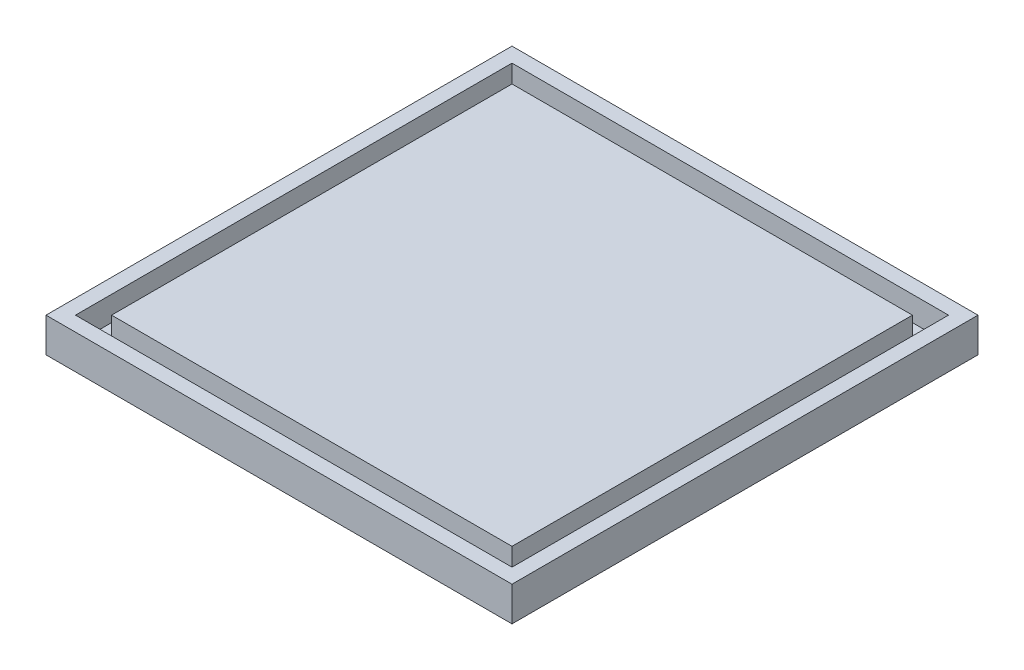
ISO-10303-21;
HEADER;
FILE_DESCRIPTION(('STEP AP214'),'2;1');
FILE_NAME('part.step','',(''),(''),'','','');
FILE_SCHEMA(('AUTOMOTIVE_DESIGN { 1 0 10303 214 1 1 1 1 }'));
ENDSEC;
DATA;
#1=APPLICATION_CONTEXT('core data for automotive mechanical design processes');
#2=APPLICATION_PROTOCOL_DEFINITION('international standard','automotive_design',2000,#1);
#3=PRODUCT_CONTEXT('',#1,'mechanical');
#4=PRODUCT('Part','Part','',(#3));
#5=PRODUCT_RELATED_PRODUCT_CATEGORY('part','',(#4));
#6=PRODUCT_DEFINITION_FORMATION('','',#4);
#7=PRODUCT_DEFINITION_CONTEXT('part definition',#1,'design');
#8=PRODUCT_DEFINITION('design','',#6,#7);
#9=PRODUCT_DEFINITION_SHAPE('','',#8);
#10=(LENGTH_UNIT() NAMED_UNIT(*) SI_UNIT(.MILLI.,.METRE.));
#11=(NAMED_UNIT(*) PLANE_ANGLE_UNIT() SI_UNIT($,.RADIAN.));
#12=(NAMED_UNIT(*) SI_UNIT($,.STERADIAN.) SOLID_ANGLE_UNIT());
#13=UNCERTAINTY_MEASURE_WITH_UNIT(LENGTH_MEASURE(1.E-05),#10,'distance_accuracy_value','');
#14=(GEOMETRIC_REPRESENTATION_CONTEXT(3) GLOBAL_UNCERTAINTY_ASSIGNED_CONTEXT((#13)) GLOBAL_UNIT_ASSIGNED_CONTEXT((#10,
#11,#12)) REPRESENTATION_CONTEXT('',''));
#15=CARTESIAN_POINT('',(0.,0.,0.));
#16=DIRECTION('',(0.,0.,1.));
#17=DIRECTION('',(1.,0.,0.));
#18=AXIS2_PLACEMENT_3D('',#15,#16,#17);
#19=CARTESIAN_POINT('',(0.,0.,0.));
#20=DIRECTION('',(0.,-1.,0.));
#21=DIRECTION('',(0.,0.,-1.));
#22=AXIS2_PLACEMENT_3D('',#19,#20,#21);
#23=PLANE('',#22);
#24=DIRECTION('',(1.,0.,0.));
#25=VECTOR('',#24,1.);
#26=CARTESIAN_POINT('',(0.,0.,-85.175));
#27=LINE('',#26,#25);
#28=CARTESIAN_POINT('',(-3.675,0.,-85.175));
#29=VERTEX_POINT('',#28);
#30=CARTESIAN_POINT('',(85.175,0.,-85.175));
#31=VERTEX_POINT('',#30);
#32=EDGE_CURVE('E115',#29,#31,#27,.T.);
#33=ORIENTED_EDGE('',*,*,#32,.F.);
#34=DIRECTION('',(0.,0.,1.));
#35=VECTOR('',#34,1.);
#36=CARTESIAN_POINT('',(-3.67499999999999,0.,0.));
#37=LINE('',#36,#35);
#38=CARTESIAN_POINT('',(-3.67499999999999,0.,3.675));
#39=VERTEX_POINT('',#38);
#40=EDGE_CURVE('E169',#29,#39,#37,.T.);
#41=ORIENTED_EDGE('',*,*,#40,.T.);
#42=DIRECTION('',(1.,0.,0.));
#43=VECTOR('',#42,1.);
#44=CARTESIAN_POINT('',(0.,0.,3.675));
#45=LINE('',#44,#43);
#46=CARTESIAN_POINT('',(85.175,0.,3.675));
#47=VERTEX_POINT('',#46);
#48=EDGE_CURVE('E106',#39,#47,#45,.T.);
#49=ORIENTED_EDGE('',*,*,#48,.T.);
#50=DIRECTION('',(0.,0.,1.));
#51=VECTOR('',#50,1.);
#52=CARTESIAN_POINT('',(85.175,0.,0.));
#53=LINE('',#52,#51);
#54=EDGE_CURVE('E147',#31,#47,#53,.T.);
#55=ORIENTED_EDGE('',*,*,#54,.F.);
#56=EDGE_LOOP('',(#33,#41,#49,#55));
#57=FACE_BOUND('',#56,.T.);
#58=DIRECTION('',(1.,0.,0.));
#59=VECTOR('',#58,1.);
#60=CARTESIAN_POINT('',(0.,0.,0.));
#61=LINE('',#60,#59);
#62=CARTESIAN_POINT('',(0.,0.,0.));
#63=VERTEX_POINT('',#62);
#64=CARTESIAN_POINT('',(81.5,0.,0.));
#65=VERTEX_POINT('',#64);
#66=EDGE_CURVE('E425',#63,#65,#61,.T.);
#67=ORIENTED_EDGE('',*,*,#66,.F.);
#68=DIRECTION('',(0.,0.,-1.));
#69=VECTOR('',#68,1.);
#70=CARTESIAN_POINT('',(0.,0.,0.));
#71=LINE('',#70,#69);
#72=CARTESIAN_POINT('',(0.,0.,-81.5));
#73=VERTEX_POINT('',#72);
#74=EDGE_CURVE('E420',#63,#73,#71,.T.);
#75=ORIENTED_EDGE('',*,*,#74,.T.);
#76=DIRECTION('',(1.,0.,0.));
#77=VECTOR('',#76,1.);
#78=CARTESIAN_POINT('',(0.,0.,-81.5));
#79=LINE('',#78,#77);
#80=CARTESIAN_POINT('',(81.5,0.,-81.5));
#81=VERTEX_POINT('',#80);
#82=EDGE_CURVE('E83',#73,#81,#79,.T.);
#83=ORIENTED_EDGE('',*,*,#82,.T.);
#84=DIRECTION('',(0.,0.,-1.));
#85=VECTOR('',#84,1.);
#86=CARTESIAN_POINT('',(81.5,0.,0.));
#87=LINE('',#86,#85);
#88=EDGE_CURVE('E429',#65,#81,#87,.T.);
#89=ORIENTED_EDGE('',*,*,#88,.F.);
#90=EDGE_LOOP('',(#67,#75,#83,#89));
#91=FACE_BOUND('',#90,.T.);
#92=ADVANCED_FACE('F65',(#57,#91),#23,.F.);
#93=CARTESIAN_POINT('',(0.,5.,-85.175));
#94=DIRECTION('',(0.,0.,-1.));
#95=DIRECTION('',(-1.,0.,0.));
#96=AXIS2_PLACEMENT_3D('',#93,#94,#95);
#97=PLANE('',#96);
#98=ORIENTED_EDGE('',*,*,#32,.T.);
#99=DIRECTION('',(0.,-1.,0.));
#100=VECTOR('',#99,1.);
#101=CARTESIAN_POINT('',(85.175,5.,-85.175));
#102=LINE('',#101,#100);
#103=CARTESIAN_POINT('',(85.175,5.,-85.175));
#104=VERTEX_POINT('',#103);
#105=EDGE_CURVE('E12',#104,#31,#102,.T.);
#106=ORIENTED_EDGE('',*,*,#105,.F.);
#107=DIRECTION('',(1.,0.,0.));
#108=VECTOR('',#107,1.);
#109=CARTESIAN_POINT('',(0.,5.,-85.175));
#110=LINE('',#109,#108);
#111=CARTESIAN_POINT('',(-3.675,5.,-85.175));
#112=VERTEX_POINT('',#111);
#113=EDGE_CURVE('E140',#112,#104,#110,.T.);
#114=ORIENTED_EDGE('',*,*,#113,.F.);
#115=DIRECTION('',(0.,-1.,0.));
#116=VECTOR('',#115,1.);
#117=CARTESIAN_POINT('',(-3.675,5.,-85.175));
#118=LINE('',#117,#116);
#119=EDGE_CURVE('E92',#112,#29,#118,.T.);
#120=ORIENTED_EDGE('',*,*,#119,.T.);
#121=EDGE_LOOP('',(#98,#106,#114,#120));
#122=FACE_BOUND('',#121,.T.);
#123=ADVANCED_FACE('F260',(#122),#97,.F.);
#124=CARTESIAN_POINT('',(85.175,5.,0.));
#125=DIRECTION('',(1.,0.,0.));
#126=DIRECTION('',(0.,0.,-1.));
#127=AXIS2_PLACEMENT_3D('',#124,#125,#126);
#128=PLANE('',#127);
#129=ORIENTED_EDGE('',*,*,#54,.T.);
#130=DIRECTION('',(0.,-1.,0.));
#131=VECTOR('',#130,1.);
#132=CARTESIAN_POINT('',(85.175,5.,3.675));
#133=LINE('',#132,#131);
#134=CARTESIAN_POINT('',(85.175,5.,3.675));
#135=VERTEX_POINT('',#134);
#136=EDGE_CURVE('E75',#135,#47,#133,.T.);
#137=ORIENTED_EDGE('',*,*,#136,.F.);
#138=DIRECTION('',(0.,0.,1.));
#139=VECTOR('',#138,1.);
#140=CARTESIAN_POINT('',(85.175,5.,0.));
#141=LINE('',#140,#139);
#142=EDGE_CURVE('E134',#104,#135,#141,.T.);
#143=ORIENTED_EDGE('',*,*,#142,.F.);
#144=ORIENTED_EDGE('',*,*,#105,.T.);
#145=EDGE_LOOP('',(#129,#137,#143,#144));
#146=FACE_BOUND('',#145,.T.);
#147=ADVANCED_FACE('F146',(#146),#128,.F.);
#148=CARTESIAN_POINT('',(0.,5.,3.675));
#149=DIRECTION('',(0.,0.,-1.));
#150=DIRECTION('',(-1.,0.,0.));
#151=AXIS2_PLACEMENT_3D('',#148,#149,#150);
#152=PLANE('',#151);
#153=ORIENTED_EDGE('',*,*,#48,.F.);
#154=DIRECTION('',(0.,-1.,0.));
#155=VECTOR('',#154,1.);
#156=CARTESIAN_POINT('',(-3.67499999999999,5.,3.675));
#157=LINE('',#156,#155);
#158=CARTESIAN_POINT('',(-3.67499999999999,5.,3.675));
#159=VERTEX_POINT('',#158);
#160=EDGE_CURVE('E150',#159,#39,#157,.T.);
#161=ORIENTED_EDGE('',*,*,#160,.F.);
#162=DIRECTION('',(1.,0.,0.));
#163=VECTOR('',#162,1.);
#164=CARTESIAN_POINT('',(0.,5.,3.675));
#165=LINE('',#164,#163);
#166=EDGE_CURVE('E139',#159,#135,#165,.T.);
#167=ORIENTED_EDGE('',*,*,#166,.T.);
#168=ORIENTED_EDGE('',*,*,#136,.T.);
#169=EDGE_LOOP('',(#153,#161,#167,#168));
#170=FACE_BOUND('',#169,.T.);
#171=ADVANCED_FACE('F152',(#170),#152,.T.);
#172=CARTESIAN_POINT('',(-6.675,5.,0.));
#173=DIRECTION('',(-1.,0.,0.));
#174=DIRECTION('',(0.,0.,1.));
#175=AXIS2_PLACEMENT_3D('',#172,#173,#174);
#176=PLANE('',#175);
#177=DIRECTION('',(0.,-1.,0.));
#178=VECTOR('',#177,1.);
#179=CARTESIAN_POINT('',(-6.675,5.,-88.175));
#180=LINE('',#179,#178);
#181=CARTESIAN_POINT('',(-6.675,5.,-88.175));
#182=VERTEX_POINT('',#181);
#183=CARTESIAN_POINT('',(-6.675,-2.,-88.175));
#184=VERTEX_POINT('',#183);
#185=EDGE_CURVE('E158',#182,#184,#180,.T.);
#186=ORIENTED_EDGE('',*,*,#185,.T.);
#187=DIRECTION('',(0.,0.,-1.));
#188=VECTOR('',#187,1.);
#189=CARTESIAN_POINT('',(-6.675,-2.,6.67500000000001));
#190=LINE('',#189,#188);
#191=CARTESIAN_POINT('',(-6.675,-2.,6.67500000000001));
#192=VERTEX_POINT('',#191);
#193=EDGE_CURVE('E211',#192,#184,#190,.T.);
#194=ORIENTED_EDGE('',*,*,#193,.F.);
#195=DIRECTION('',(0.,-1.,0.));
#196=VECTOR('',#195,1.);
#197=CARTESIAN_POINT('',(-6.675,5.,6.67500000000001));
#198=LINE('',#197,#196);
#199=CARTESIAN_POINT('',(-6.675,5.,6.67500000000001));
#200=VERTEX_POINT('',#199);
#201=EDGE_CURVE('E69',#200,#192,#198,.T.);
#202=ORIENTED_EDGE('',*,*,#201,.F.);
#203=DIRECTION('',(0.,0.,-1.));
#204=VECTOR('',#203,1.);
#205=CARTESIAN_POINT('',(-6.675,5.,0.));
#206=LINE('',#205,#204);
#207=EDGE_CURVE('E172',#200,#182,#206,.T.);
#208=ORIENTED_EDGE('',*,*,#207,.T.);
#209=EDGE_LOOP('',(#186,#194,#202,#208));
#210=FACE_BOUND('',#209,.T.);
#211=ADVANCED_FACE('F67',(#210),#176,.T.);
#212=CARTESIAN_POINT('',(0.,5.,6.67500000000001));
#213=DIRECTION('',(0.,0.,1.));
#214=DIRECTION('',(1.,0.,0.));
#215=AXIS2_PLACEMENT_3D('',#212,#213,#214);
#216=PLANE('',#215);
#217=ORIENTED_EDGE('',*,*,#201,.T.);
#218=DIRECTION('',(-1.,0.,0.));
#219=VECTOR('',#218,1.);
#220=CARTESIAN_POINT('',(-6.675,-2.,6.67500000000001));
#221=LINE('',#220,#219);
#222=CARTESIAN_POINT('',(88.175,-2.,6.67500000000001));
#223=VERTEX_POINT('',#222);
#224=EDGE_CURVE('E164',#223,#192,#221,.T.);
#225=ORIENTED_EDGE('',*,*,#224,.F.);
#226=DIRECTION('',(0.,-1.,0.));
#227=VECTOR('',#226,1.);
#228=CARTESIAN_POINT('',(88.175,5.,6.675));
#229=LINE('',#228,#227);
#230=CARTESIAN_POINT('',(88.175,5.,6.675));
#231=VERTEX_POINT('',#230);
#232=EDGE_CURVE('E183',#231,#223,#229,.T.);
#233=ORIENTED_EDGE('',*,*,#232,.F.);
#234=DIRECTION('',(-1.,0.,0.));
#235=VECTOR('',#234,1.);
#236=CARTESIAN_POINT('',(0.,5.,6.67500000000001));
#237=LINE('',#236,#235);
#238=EDGE_CURVE('E200',#231,#200,#237,.T.);
#239=ORIENTED_EDGE('',*,*,#238,.T.);
#240=EDGE_LOOP('',(#217,#225,#233,#239));
#241=FACE_BOUND('',#240,.T.);
#242=ADVANCED_FACE('F198',(#241),#216,.T.);
#243=CARTESIAN_POINT('',(88.175,5.,0.));
#244=DIRECTION('',(-1.,0.,0.));
#245=DIRECTION('',(0.,0.,1.));
#246=AXIS2_PLACEMENT_3D('',#243,#244,#245);
#247=PLANE('',#246);
#248=ORIENTED_EDGE('',*,*,#232,.T.);
#249=DIRECTION('',(0.,0.,1.));
#250=VECTOR('',#249,1.);
#251=CARTESIAN_POINT('',(88.175,-2.,6.67500000000001));
#252=LINE('',#251,#250);
#253=CARTESIAN_POINT('',(88.175,-2.,-88.175));
#254=VERTEX_POINT('',#253);
#255=EDGE_CURVE('E212',#254,#223,#252,.T.);
#256=ORIENTED_EDGE('',*,*,#255,.F.);
#257=DIRECTION('',(0.,-1.,0.));
#258=VECTOR('',#257,1.);
#259=CARTESIAN_POINT('',(88.175,5.,-88.175));
#260=LINE('',#259,#258);
#261=CARTESIAN_POINT('',(88.175,5.,-88.175));
#262=VERTEX_POINT('',#261);
#263=EDGE_CURVE('E180',#262,#254,#260,.T.);
#264=ORIENTED_EDGE('',*,*,#263,.F.);
#265=DIRECTION('',(0.,0.,-1.));
#266=VECTOR('',#265,1.);
#267=CARTESIAN_POINT('',(88.175,5.,0.));
#268=LINE('',#267,#266);
#269=EDGE_CURVE('E235',#231,#262,#268,.T.);
#270=ORIENTED_EDGE('',*,*,#269,.F.);
#271=EDGE_LOOP('',(#248,#256,#264,#270));
#272=FACE_BOUND('',#271,.T.);
#273=ADVANCED_FACE('F250',(#272),#247,.F.);
#274=CARTESIAN_POINT('',(0.,5.,-88.175));
#275=DIRECTION('',(0.,0.,1.));
#276=DIRECTION('',(1.,0.,0.));
#277=AXIS2_PLACEMENT_3D('',#274,#275,#276);
#278=PLANE('',#277);
#279=ORIENTED_EDGE('',*,*,#263,.T.);
#280=DIRECTION('',(1.,0.,0.));
#281=VECTOR('',#280,1.);
#282=CARTESIAN_POINT('',(-6.675,-2.,-88.175));
#283=LINE('',#282,#281);
#284=EDGE_CURVE('E218',#184,#254,#283,.T.);
#285=ORIENTED_EDGE('',*,*,#284,.F.);
#286=ORIENTED_EDGE('',*,*,#185,.F.);
#287=DIRECTION('',(-1.,0.,0.));
#288=VECTOR('',#287,1.);
#289=CARTESIAN_POINT('',(0.,5.,-88.175));
#290=LINE('',#289,#288);
#291=EDGE_CURVE('E238',#262,#182,#290,.T.);
#292=ORIENTED_EDGE('',*,*,#291,.F.);
#293=EDGE_LOOP('',(#279,#285,#286,#292));
#294=FACE_BOUND('',#293,.T.);
#295=ADVANCED_FACE('F245',(#294),#278,.F.);
#296=CARTESIAN_POINT('',(-3.67499999999999,5.,0.));
#297=DIRECTION('',(1.,0.,0.));
#298=DIRECTION('',(0.,0.,-1.));
#299=AXIS2_PLACEMENT_3D('',#296,#297,#298);
#300=PLANE('',#299);
#301=ORIENTED_EDGE('',*,*,#40,.F.);
#302=ORIENTED_EDGE('',*,*,#119,.F.);
#303=DIRECTION('',(0.,0.,1.));
#304=VECTOR('',#303,1.);
#305=CARTESIAN_POINT('',(-3.67499999999999,5.,0.));
#306=LINE('',#305,#304);
#307=EDGE_CURVE('E155',#112,#159,#306,.T.);
#308=ORIENTED_EDGE('',*,*,#307,.T.);
#309=ORIENTED_EDGE('',*,*,#160,.T.);
#310=EDGE_LOOP('',(#301,#302,#308,#309));
#311=FACE_BOUND('',#310,.T.);
#312=ADVANCED_FACE('F257',(#311),#300,.T.);
#313=CARTESIAN_POINT('',(0.,5.,0.));
#314=DIRECTION('',(0.,1.,0.));
#315=DIRECTION('',(0.,0.,1.));
#316=AXIS2_PLACEMENT_3D('',#313,#314,#315);
#317=PLANE('',#316);
#318=ORIENTED_EDGE('',*,*,#207,.F.);
#319=ORIENTED_EDGE('',*,*,#238,.F.);
#320=ORIENTED_EDGE('',*,*,#269,.T.);
#321=ORIENTED_EDGE('',*,*,#291,.T.);
#322=EDGE_LOOP('',(#318,#319,#320,#321));
#323=FACE_BOUND('',#322,.T.);
#324=ORIENTED_EDGE('',*,*,#113,.T.);
#325=ORIENTED_EDGE('',*,*,#142,.T.);
#326=ORIENTED_EDGE('',*,*,#166,.F.);
#327=ORIENTED_EDGE('',*,*,#307,.F.);
#328=EDGE_LOOP('',(#324,#325,#326,#327));
#329=FACE_BOUND('',#328,.T.);
#330=ADVANCED_FACE('F136',(#323,#329),#317,.T.);
#331=CARTESIAN_POINT('',(0.,-2.,0.));
#332=DIRECTION('',(0.,-1.,0.));
#333=DIRECTION('',(0.,0.,-1.));
#334=AXIS2_PLACEMENT_3D('',#331,#332,#333);
#335=PLANE('',#334);
#336=ORIENTED_EDGE('',*,*,#193,.T.);
#337=ORIENTED_EDGE('',*,*,#284,.T.);
#338=ORIENTED_EDGE('',*,*,#255,.T.);
#339=ORIENTED_EDGE('',*,*,#224,.T.);
#340=EDGE_LOOP('',(#336,#337,#338,#339));
#341=FACE_BOUND('',#340,.T.);
#342=ADVANCED_FACE('F208',(#341),#335,.T.);
#343=CARTESIAN_POINT('',(0.,5.,0.));
#344=DIRECTION('',(0.,0.,-1.));
#345=DIRECTION('',(-1.,0.,0.));
#346=AXIS2_PLACEMENT_3D('',#343,#344,#345);
#347=PLANE('',#346);
#348=ORIENTED_EDGE('',*,*,#66,.T.);
#349=DIRECTION('',(0.,-1.,0.));
#350=VECTOR('',#349,1.);
#351=CARTESIAN_POINT('',(81.5,5.,0.));
#352=LINE('',#351,#350);
#353=CARTESIAN_POINT('',(81.5,5.,0.));
#354=VERTEX_POINT('',#353);
#355=EDGE_CURVE('E219',#354,#65,#352,.T.);
#356=ORIENTED_EDGE('',*,*,#355,.F.);
#357=DIRECTION('',(1.,0.,0.));
#358=VECTOR('',#357,1.);
#359=CARTESIAN_POINT('',(0.,5.,0.));
#360=LINE('',#359,#358);
#361=CARTESIAN_POINT('',(0.,5.,0.));
#362=VERTEX_POINT('',#361);
#363=EDGE_CURVE('E407',#362,#354,#360,.T.);
#364=ORIENTED_EDGE('',*,*,#363,.F.);
#365=DIRECTION('',(0.,-1.,0.));
#366=VECTOR('',#365,1.);
#367=CARTESIAN_POINT('',(0.,5.,0.));
#368=LINE('',#367,#366);
#369=EDGE_CURVE('E437',#362,#63,#368,.T.);
#370=ORIENTED_EDGE('',*,*,#369,.T.);
#371=EDGE_LOOP('',(#348,#356,#364,#370));
#372=FACE_BOUND('',#371,.T.);
#373=ADVANCED_FACE('F324',(#372),#347,.F.);
#374=CARTESIAN_POINT('',(81.5,5.,0.));
#375=DIRECTION('',(-1.,0.,0.));
#376=DIRECTION('',(0.,0.,1.));
#377=AXIS2_PLACEMENT_3D('',#374,#375,#376);
#378=PLANE('',#377);
#379=ORIENTED_EDGE('',*,*,#88,.T.);
#380=DIRECTION('',(0.,-1.,0.));
#381=VECTOR('',#380,1.);
#382=CARTESIAN_POINT('',(81.5,5.,-81.5));
#383=LINE('',#382,#381);
#384=CARTESIAN_POINT('',(81.5,5.,-81.5));
#385=VERTEX_POINT('',#384);
#386=EDGE_CURVE('E225',#385,#81,#383,.T.);
#387=ORIENTED_EDGE('',*,*,#386,.F.);
#388=DIRECTION('',(0.,0.,-1.));
#389=VECTOR('',#388,1.);
#390=CARTESIAN_POINT('',(81.5,5.,0.));
#391=LINE('',#390,#389);
#392=EDGE_CURVE('E412',#354,#385,#391,.T.);
#393=ORIENTED_EDGE('',*,*,#392,.F.);
#394=ORIENTED_EDGE('',*,*,#355,.T.);
#395=EDGE_LOOP('',(#379,#387,#393,#394));
#396=FACE_BOUND('',#395,.T.);
#397=ADVANCED_FACE('F332',(#396),#378,.F.);
#398=CARTESIAN_POINT('',(0.,5.,-81.5));
#399=DIRECTION('',(0.,0.,-1.));
#400=DIRECTION('',(-1.,0.,0.));
#401=AXIS2_PLACEMENT_3D('',#398,#399,#400);
#402=PLANE('',#401);
#403=ORIENTED_EDGE('',*,*,#82,.F.);
#404=DIRECTION('',(0.,-1.,0.));
#405=VECTOR('',#404,1.);
#406=CARTESIAN_POINT('',(0.,5.,-81.5));
#407=LINE('',#406,#405);
#408=CARTESIAN_POINT('',(0.,5.,-81.5));
#409=VERTEX_POINT('',#408);
#410=EDGE_CURVE('E440',#409,#73,#407,.T.);
#411=ORIENTED_EDGE('',*,*,#410,.F.);
#412=DIRECTION('',(1.,0.,0.));
#413=VECTOR('',#412,1.);
#414=CARTESIAN_POINT('',(0.,5.,-81.5));
#415=LINE('',#414,#413);
#416=EDGE_CURVE('E457',#409,#385,#415,.T.);
#417=ORIENTED_EDGE('',*,*,#416,.T.);
#418=ORIENTED_EDGE('',*,*,#386,.T.);
#419=EDGE_LOOP('',(#403,#411,#417,#418));
#420=FACE_BOUND('',#419,.T.);
#421=ADVANCED_FACE('F341',(#420),#402,.T.);
#422=CARTESIAN_POINT('',(0.,5.,0.));
#423=DIRECTION('',(-1.,0.,0.));
#424=DIRECTION('',(0.,0.,1.));
#425=AXIS2_PLACEMENT_3D('',#422,#423,#424);
#426=PLANE('',#425);
#427=ORIENTED_EDGE('',*,*,#74,.F.);
#428=ORIENTED_EDGE('',*,*,#369,.F.);
#429=DIRECTION('',(0.,0.,-1.));
#430=VECTOR('',#429,1.);
#431=CARTESIAN_POINT('',(0.,5.,0.));
#432=LINE('',#431,#430);
#433=EDGE_CURVE('E415',#362,#409,#432,.T.);
#434=ORIENTED_EDGE('',*,*,#433,.T.);
#435=ORIENTED_EDGE('',*,*,#410,.T.);
#436=EDGE_LOOP('',(#427,#428,#434,#435));
#437=FACE_BOUND('',#436,.T.);
#438=ADVANCED_FACE('F351',(#437),#426,.T.);
#439=CARTESIAN_POINT('',(0.,5.,0.));
#440=DIRECTION('',(0.,1.,0.));
#441=DIRECTION('',(0.,0.,1.));
#442=AXIS2_PLACEMENT_3D('',#439,#440,#441);
#443=PLANE('',#442);
#444=ORIENTED_EDGE('',*,*,#363,.T.);
#445=ORIENTED_EDGE('',*,*,#392,.T.);
#446=ORIENTED_EDGE('',*,*,#416,.F.);
#447=ORIENTED_EDGE('',*,*,#433,.F.);
#448=EDGE_LOOP('',(#444,#445,#446,#447));
#449=FACE_BOUND('',#448,.T.);
#450=ADVANCED_FACE('F360',(#449),#443,.T.);
#451=CLOSED_SHELL('',(#92,#123,#147,#171,#211,#242,#273,#295,#312,#330,#342,#373,#397,#421,#438,#450));
#452=MANIFOLD_SOLID_BREP('B2',#451);
#453=ADVANCED_BREP_SHAPE_REPRESENTATION('',(#18,#452),#14);
#454=SHAPE_DEFINITION_REPRESENTATION(#9,#453);
ENDSEC;
END-ISO-10303-21;
